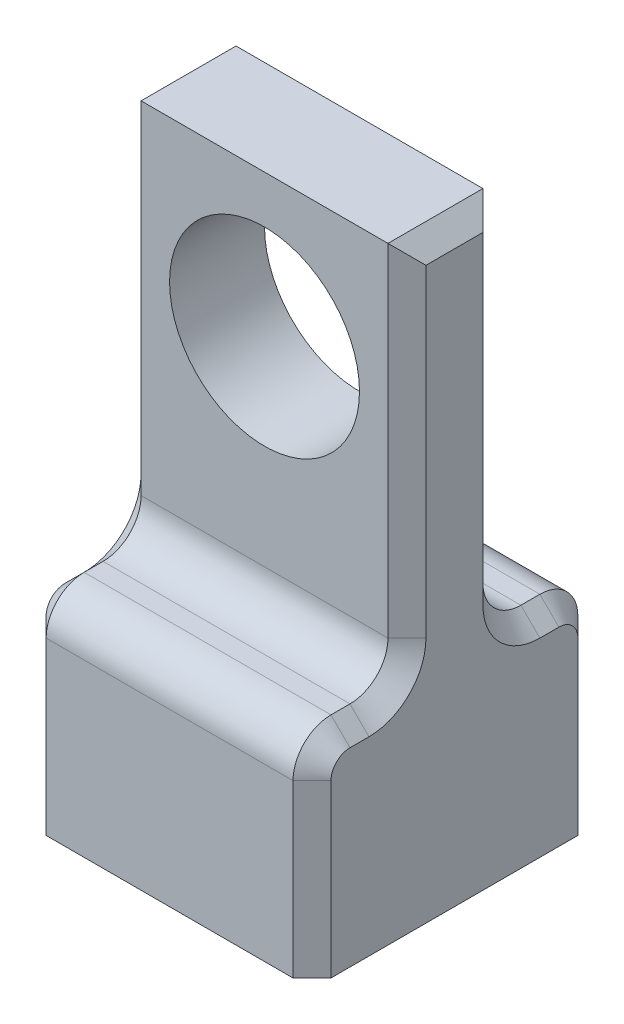
ISO-10303-21;
HEADER;
FILE_DESCRIPTION(('STEP AP214'),'2;1');
FILE_NAME('part.step','',(''),(''),'','','');
FILE_SCHEMA(('AUTOMOTIVE_DESIGN { 1 0 10303 214 1 1 1 1 }'));
ENDSEC;
DATA;
#1=APPLICATION_CONTEXT('core data for automotive mechanical design processes');
#2=APPLICATION_PROTOCOL_DEFINITION('international standard','automotive_design',2000,#1);
#3=PRODUCT_CONTEXT('',#1,'mechanical');
#4=PRODUCT('Part','Part','',(#3));
#5=PRODUCT_RELATED_PRODUCT_CATEGORY('part','',(#4));
#6=PRODUCT_DEFINITION_FORMATION('','',#4);
#7=PRODUCT_DEFINITION_CONTEXT('part definition',#1,'design');
#8=PRODUCT_DEFINITION('design','',#6,#7);
#9=PRODUCT_DEFINITION_SHAPE('','',#8);
#10=(LENGTH_UNIT() NAMED_UNIT(*) SI_UNIT(.MILLI.,.METRE.));
#11=(NAMED_UNIT(*) PLANE_ANGLE_UNIT() SI_UNIT($,.RADIAN.));
#12=(NAMED_UNIT(*) SI_UNIT($,.STERADIAN.) SOLID_ANGLE_UNIT());
#13=UNCERTAINTY_MEASURE_WITH_UNIT(LENGTH_MEASURE(1.E-05),#10,'distance_accuracy_value','');
#14=(GEOMETRIC_REPRESENTATION_CONTEXT(3) GLOBAL_UNCERTAINTY_ASSIGNED_CONTEXT((#13)) GLOBAL_UNIT_ASSIGNED_CONTEXT((#10,
#11,#12)) REPRESENTATION_CONTEXT('',''));
#15=CARTESIAN_POINT('',(0.,0.,0.));
#16=DIRECTION('',(0.,0.,1.));
#17=DIRECTION('',(1.,0.,0.));
#18=AXIS2_PLACEMENT_3D('',#15,#16,#17);
#19=CARTESIAN_POINT('',(-7.5,31.,-7.5));
#20=DIRECTION('',(1.,0.,0.));
#21=DIRECTION('',(0.,0.,-1.));
#22=AXIS2_PLACEMENT_3D('',#19,#20,#21);
#23=PLANE('',#22);
#24=DIRECTION('',(0.,0.,1.));
#25=VECTOR('',#24,1.);
#26=CARTESIAN_POINT('',(-7.5,0.,-7.5));
#27=LINE('',#26,#25);
#28=CARTESIAN_POINT('',(-7.5,0.,-6.49999999999999));
#29=VERTEX_POINT('',#28);
#30=CARTESIAN_POINT('',(-7.5,0.,6.50000000000001));
#31=VERTEX_POINT('',#30);
#32=EDGE_CURVE('E402',#29,#31,#27,.T.);
#33=ORIENTED_EDGE('',*,*,#32,.T.);
#34=DIRECTION('',(0.,1.,0.));
#35=VECTOR('',#34,1.);
#36=CARTESIAN_POINT('',(-7.5,31.,6.50000000000001));
#37=LINE('',#36,#35);
#38=CARTESIAN_POINT('',(-7.5,9.,6.50000000000001));
#39=VERTEX_POINT('',#38);
#40=EDGE_CURVE('E295',#31,#39,#37,.T.);
#41=ORIENTED_EDGE('',*,*,#40,.T.);
#42=CARTESIAN_POINT('',(-7.5,9.,5.5));
#43=DIRECTION('',(1.,0.,0.));
#44=DIRECTION('',(0.,0.,-1.));
#45=AXIS2_PLACEMENT_3D('',#42,#43,#44);
#46=CIRCLE('',#45,1.00000000000001);
#47=CARTESIAN_POINT('',(-7.5,10.,5.5));
#48=VERTEX_POINT('',#47);
#49=EDGE_CURVE('E292',#39,#48,#46,.F.);
#50=ORIENTED_EDGE('',*,*,#49,.T.);
#51=DIRECTION('',(0.,0.,-1.));
#52=VECTOR('',#51,1.);
#53=CARTESIAN_POINT('',(-7.5,10.,4.5));
#54=LINE('',#53,#52);
#55=CARTESIAN_POINT('',(-7.5,10.,4.5));
#56=VERTEX_POINT('',#55);
#57=EDGE_CURVE('E287',#48,#56,#54,.T.);
#58=ORIENTED_EDGE('',*,*,#57,.T.);
#59=CARTESIAN_POINT('',(-7.5,13.,4.5));
#60=DIRECTION('',(1.,0.,0.));
#61=DIRECTION('',(0.,0.,-1.));
#62=AXIS2_PLACEMENT_3D('',#59,#60,#61);
#63=CIRCLE('',#62,2.99999999999999);
#64=CARTESIAN_POINT('',(-7.5,13.,1.50000000000001));
#65=VERTEX_POINT('',#64);
#66=EDGE_CURVE('E286',#56,#65,#63,.T.);
#67=ORIENTED_EDGE('',*,*,#66,.T.);
#68=DIRECTION('',(0.,1.,0.));
#69=VECTOR('',#68,1.);
#70=CARTESIAN_POINT('',(-7.5,31.,1.50000000000001));
#71=LINE('',#70,#69);
#72=CARTESIAN_POINT('',(-7.5,30.,1.50000000000001));
#73=VERTEX_POINT('',#72);
#74=EDGE_CURVE('E288',#65,#73,#71,.T.);
#75=ORIENTED_EDGE('',*,*,#74,.T.);
#76=DIRECTION('',(0.,0.,-1.));
#77=VECTOR('',#76,1.);
#78=CARTESIAN_POINT('',(-7.5,30.,-7.5));
#79=LINE('',#78,#77);
#80=CARTESIAN_POINT('',(-7.5,30.,-1.49999999999999));
#81=VERTEX_POINT('',#80);
#82=EDGE_CURVE('E284',#73,#81,#79,.T.);
#83=ORIENTED_EDGE('',*,*,#82,.T.);
#84=DIRECTION('',(0.,-1.,0.));
#85=VECTOR('',#84,1.);
#86=CARTESIAN_POINT('',(-7.5,31.,-1.49999999999999));
#87=LINE('',#86,#85);
#88=CARTESIAN_POINT('',(-7.5,13.,-1.49999999999999));
#89=VERTEX_POINT('',#88);
#90=EDGE_CURVE('E240',#81,#89,#87,.T.);
#91=ORIENTED_EDGE('',*,*,#90,.T.);
#92=CARTESIAN_POINT('',(-7.5,13.,-4.5));
#93=DIRECTION('',(1.,0.,0.));
#94=DIRECTION('',(0.,0.,-1.));
#95=AXIS2_PLACEMENT_3D('',#92,#93,#94);
#96=CIRCLE('',#95,3.00000000000001);
#97=CARTESIAN_POINT('',(-7.5,9.99999999999999,-4.5));
#98=VERTEX_POINT('',#97);
#99=EDGE_CURVE('E282',#89,#98,#96,.T.);
#100=ORIENTED_EDGE('',*,*,#99,.T.);
#101=DIRECTION('',(0.,0.,-1.));
#102=VECTOR('',#101,1.);
#103=CARTESIAN_POINT('',(-7.5,9.99999999999999,-5.5));
#104=LINE('',#103,#102);
#105=CARTESIAN_POINT('',(-7.5,9.99999999999999,-5.5));
#106=VERTEX_POINT('',#105);
#107=EDGE_CURVE('E276',#98,#106,#104,.T.);
#108=ORIENTED_EDGE('',*,*,#107,.T.);
#109=CARTESIAN_POINT('',(-7.5,9.,-5.5));
#110=DIRECTION('',(1.,0.,0.));
#111=DIRECTION('',(0.,0.,-1.));
#112=AXIS2_PLACEMENT_3D('',#109,#110,#111);
#113=CIRCLE('',#112,0.999999999999987);
#114=CARTESIAN_POINT('',(-7.5,9.,-6.49999999999999));
#115=VERTEX_POINT('',#114);
#116=EDGE_CURVE('E273',#106,#115,#113,.F.);
#117=ORIENTED_EDGE('',*,*,#116,.T.);
#118=DIRECTION('',(0.,-1.,0.));
#119=VECTOR('',#118,1.);
#120=CARTESIAN_POINT('',(-7.5,31.,-6.49999999999999));
#121=LINE('',#120,#119);
#122=EDGE_CURVE('E280',#115,#29,#121,.T.);
#123=ORIENTED_EDGE('',*,*,#122,.T.);
#124=EDGE_LOOP('',(#33,#41,#50,#58,#67,#75,#83,#91,#100,#108,#117,#123));
#125=FACE_BOUND('',#124,.T.);
#126=ADVANCED_FACE('F41',(#125),#23,.F.);
#127=CARTESIAN_POINT('',(7.5,31.,7.5));
#128=DIRECTION('',(0.,0.,-1.));
#129=DIRECTION('',(-1.,0.,0.));
#130=AXIS2_PLACEMENT_3D('',#127,#128,#129);
#131=PLANE('',#130);
#132=DIRECTION('',(1.,0.,0.));
#133=VECTOR('',#132,1.);
#134=CARTESIAN_POINT('',(-7.5,9.,7.5));
#135=LINE('',#134,#133);
#136=CARTESIAN_POINT('',(6.49999999999999,9.,7.5));
#137=VERTEX_POINT('',#136);
#138=CARTESIAN_POINT('',(-6.5,9.,7.5));
#139=VERTEX_POINT('',#138);
#140=EDGE_CURVE('E427',#137,#139,#135,.F.);
#141=ORIENTED_EDGE('',*,*,#140,.T.);
#142=DIRECTION('',(0.,-1.,0.));
#143=VECTOR('',#142,1.);
#144=CARTESIAN_POINT('',(-6.5,31.,7.5));
#145=LINE('',#144,#143);
#146=CARTESIAN_POINT('',(-6.5,0.,7.5));
#147=VERTEX_POINT('',#146);
#148=EDGE_CURVE('E296',#139,#147,#145,.T.);
#149=ORIENTED_EDGE('',*,*,#148,.T.);
#150=DIRECTION('',(1.,0.,0.));
#151=VECTOR('',#150,1.);
#152=CARTESIAN_POINT('',(7.5,0.,7.5));
#153=LINE('',#152,#151);
#154=CARTESIAN_POINT('',(6.49999999999999,0.,7.5));
#155=VERTEX_POINT('',#154);
#156=EDGE_CURVE('E409',#147,#155,#153,.T.);
#157=ORIENTED_EDGE('',*,*,#156,.T.);
#158=DIRECTION('',(0.,1.,0.));
#159=VECTOR('',#158,1.);
#160=CARTESIAN_POINT('',(6.49999999999999,31.,7.5));
#161=LINE('',#160,#159);
#162=EDGE_CURVE('E298',#155,#137,#161,.T.);
#163=ORIENTED_EDGE('',*,*,#162,.T.);
#164=EDGE_LOOP('',(#141,#149,#157,#163));
#165=FACE_BOUND('',#164,.T.);
#166=ADVANCED_FACE('F462',(#165),#131,.F.);
#167=CARTESIAN_POINT('',(7.5,31.,-7.5));
#168=DIRECTION('',(-1.,0.,0.));
#169=DIRECTION('',(0.,0.,1.));
#170=AXIS2_PLACEMENT_3D('',#167,#168,#169);
#171=PLANE('',#170);
#172=DIRECTION('',(0.,0.,-1.));
#173=VECTOR('',#172,1.);
#174=CARTESIAN_POINT('',(7.5,0.,-7.5));
#175=LINE('',#174,#173);
#176=CARTESIAN_POINT('',(7.5,0.,6.49999999999999));
#177=VERTEX_POINT('',#176);
#178=CARTESIAN_POINT('',(7.5,0.,-6.5));
#179=VERTEX_POINT('',#178);
#180=EDGE_CURVE('E415',#177,#179,#175,.T.);
#181=ORIENTED_EDGE('',*,*,#180,.T.);
#182=DIRECTION('',(0.,1.,0.));
#183=VECTOR('',#182,1.);
#184=CARTESIAN_POINT('',(7.5,31.,-6.5));
#185=LINE('',#184,#183);
#186=CARTESIAN_POINT('',(7.5,9.,-6.5));
#187=VERTEX_POINT('',#186);
#188=EDGE_CURVE('E271',#179,#187,#185,.T.);
#189=ORIENTED_EDGE('',*,*,#188,.T.);
#190=CARTESIAN_POINT('',(7.5,9.,-5.5));
#191=DIRECTION('',(-1.,0.,0.));
#192=DIRECTION('',(0.,0.,1.));
#193=AXIS2_PLACEMENT_3D('',#190,#191,#192);
#194=CIRCLE('',#193,0.999999999999996);
#195=CARTESIAN_POINT('',(7.5,9.99999999999999,-5.5));
#196=VERTEX_POINT('',#195);
#197=EDGE_CURVE('E272',#187,#196,#194,.F.);
#198=ORIENTED_EDGE('',*,*,#197,.T.);
#199=DIRECTION('',(0.,0.,1.));
#200=VECTOR('',#199,1.);
#201=CARTESIAN_POINT('',(7.5,9.99999999999999,-4.5));
#202=LINE('',#201,#200);
#203=CARTESIAN_POINT('',(7.5,10.,-4.5));
#204=VERTEX_POINT('',#203);
#205=EDGE_CURVE('E269',#196,#204,#202,.T.);
#206=ORIENTED_EDGE('',*,*,#205,.T.);
#207=CARTESIAN_POINT('',(7.5,13.,-4.5));
#208=DIRECTION('',(-1.,0.,0.));
#209=DIRECTION('',(0.,0.,1.));
#210=AXIS2_PLACEMENT_3D('',#207,#208,#209);
#211=CIRCLE('',#210,3.);
#212=CARTESIAN_POINT('',(7.5,13.,-1.5));
#213=VERTEX_POINT('',#212);
#214=EDGE_CURVE('E270',#204,#213,#211,.T.);
#215=ORIENTED_EDGE('',*,*,#214,.T.);
#216=DIRECTION('',(0.,1.,0.));
#217=VECTOR('',#216,1.);
#218=CARTESIAN_POINT('',(7.5,31.,-1.5));
#219=LINE('',#218,#217);
#220=CARTESIAN_POINT('',(7.5,30.,-1.5));
#221=VERTEX_POINT('',#220);
#222=EDGE_CURVE('E261',#213,#221,#219,.T.);
#223=ORIENTED_EDGE('',*,*,#222,.T.);
#224=DIRECTION('',(0.,0.,1.));
#225=VECTOR('',#224,1.);
#226=CARTESIAN_POINT('',(7.5,30.,-7.5));
#227=LINE('',#226,#225);
#228=CARTESIAN_POINT('',(7.5,30.,1.5));
#229=VERTEX_POINT('',#228);
#230=EDGE_CURVE('E263',#221,#229,#227,.T.);
#231=ORIENTED_EDGE('',*,*,#230,.T.);
#232=DIRECTION('',(0.,-1.,0.));
#233=VECTOR('',#232,1.);
#234=CARTESIAN_POINT('',(7.5,31.,1.5));
#235=LINE('',#234,#233);
#236=CARTESIAN_POINT('',(7.5,13.,1.5));
#237=VERTEX_POINT('',#236);
#238=EDGE_CURVE('E262',#229,#237,#235,.T.);
#239=ORIENTED_EDGE('',*,*,#238,.T.);
#240=CARTESIAN_POINT('',(7.5,13.,4.5));
#241=DIRECTION('',(-1.,0.,0.));
#242=DIRECTION('',(0.,0.,1.));
#243=AXIS2_PLACEMENT_3D('',#240,#241,#242);
#244=CIRCLE('',#243,3.);
#245=CARTESIAN_POINT('',(7.5,9.99999999999999,4.5));
#246=VERTEX_POINT('',#245);
#247=EDGE_CURVE('E256',#237,#246,#244,.T.);
#248=ORIENTED_EDGE('',*,*,#247,.T.);
#249=DIRECTION('',(0.,0.,1.));
#250=VECTOR('',#249,1.);
#251=CARTESIAN_POINT('',(7.5,9.99999999999999,5.5));
#252=LINE('',#251,#250);
#253=CARTESIAN_POINT('',(7.5,9.99999999999999,5.5));
#254=VERTEX_POINT('',#253);
#255=EDGE_CURVE('E260',#246,#254,#252,.T.);
#256=ORIENTED_EDGE('',*,*,#255,.T.);
#257=CARTESIAN_POINT('',(7.5,9.,5.5));
#258=DIRECTION('',(-1.,0.,0.));
#259=DIRECTION('',(0.,0.,1.));
#260=AXIS2_PLACEMENT_3D('',#257,#258,#259);
#261=CIRCLE('',#260,0.999999999999997);
#262=CARTESIAN_POINT('',(7.5,9.,6.49999999999999));
#263=VERTEX_POINT('',#262);
#264=EDGE_CURVE('E247',#254,#263,#261,.F.);
#265=ORIENTED_EDGE('',*,*,#264,.T.);
#266=DIRECTION('',(0.,-1.,0.));
#267=VECTOR('',#266,1.);
#268=CARTESIAN_POINT('',(7.5,31.,6.49999999999999));
#269=LINE('',#268,#267);
#270=EDGE_CURVE('E253',#263,#177,#269,.T.);
#271=ORIENTED_EDGE('',*,*,#270,.T.);
#272=EDGE_LOOP('',(#181,#189,#198,#206,#215,#223,#231,#239,#248,#256,#265,#271));
#273=FACE_BOUND('',#272,.T.);
#274=ADVANCED_FACE('F454',(#273),#171,.F.);
#275=CARTESIAN_POINT('',(7.5,31.,-7.5));
#276=DIRECTION('',(0.,0.,1.));
#277=DIRECTION('',(1.,0.,0.));
#278=AXIS2_PLACEMENT_3D('',#275,#276,#277);
#279=PLANE('',#278);
#280=DIRECTION('',(-1.,0.,0.));
#281=VECTOR('',#280,1.);
#282=CARTESIAN_POINT('',(7.5,0.,-7.5));
#283=LINE('',#282,#281);
#284=CARTESIAN_POINT('',(6.49999999999999,0.,-7.5));
#285=VERTEX_POINT('',#284);
#286=CARTESIAN_POINT('',(-6.49999999999998,0.,-7.5));
#287=VERTEX_POINT('',#286);
#288=EDGE_CURVE('E417',#285,#287,#283,.T.);
#289=ORIENTED_EDGE('',*,*,#288,.T.);
#290=DIRECTION('',(0.,1.,0.));
#291=VECTOR('',#290,1.);
#292=CARTESIAN_POINT('',(-6.49999999999998,31.,-7.5));
#293=LINE('',#292,#291);
#294=CARTESIAN_POINT('',(-6.49999999999998,9.,-7.5));
#295=VERTEX_POINT('',#294);
#296=EDGE_CURVE('E63',#287,#295,#293,.T.);
#297=ORIENTED_EDGE('',*,*,#296,.T.);
#298=DIRECTION('',(-1.,0.,0.));
#299=VECTOR('',#298,1.);
#300=CARTESIAN_POINT('',(7.5,9.,-7.5));
#301=LINE('',#300,#299);
#302=CARTESIAN_POINT('',(6.49999999999999,9.,-7.5));
#303=VERTEX_POINT('',#302);
#304=EDGE_CURVE('E437',#295,#303,#301,.F.);
#305=ORIENTED_EDGE('',*,*,#304,.T.);
#306=DIRECTION('',(0.,-1.,0.));
#307=VECTOR('',#306,1.);
#308=CARTESIAN_POINT('',(6.49999999999999,31.,-7.5));
#309=LINE('',#308,#307);
#310=EDGE_CURVE('E335',#303,#285,#309,.T.);
#311=ORIENTED_EDGE('',*,*,#310,.T.);
#312=EDGE_LOOP('',(#289,#297,#305,#311));
#313=FACE_BOUND('',#312,.T.);
#314=ADVANCED_FACE('F441',(#313),#279,.F.);
#315=CARTESIAN_POINT('',(0.,31.,0.));
#316=DIRECTION('',(0.,-1.,0.));
#317=DIRECTION('',(0.,0.,-1.));
#318=AXIS2_PLACEMENT_3D('',#315,#316,#317);
#319=PLANE('',#318);
#320=DIRECTION('',(-1.,0.,0.));
#321=VECTOR('',#320,1.);
#322=CARTESIAN_POINT('',(7.5,31.,2.5));
#323=LINE('',#322,#321);
#324=CARTESIAN_POINT('',(6.49999999999999,31.,2.5));
#325=VERTEX_POINT('',#324);
#326=CARTESIAN_POINT('',(-6.49999999999999,31.,2.5));
#327=VERTEX_POINT('',#326);
#328=EDGE_CURVE('E233',#325,#327,#323,.T.);
#329=ORIENTED_EDGE('',*,*,#328,.F.);
#330=DIRECTION('',(0.,0.,-1.));
#331=VECTOR('',#330,1.);
#332=CARTESIAN_POINT('',(6.50000000000001,31.,0.));
#333=LINE('',#332,#331);
#334=CARTESIAN_POINT('',(6.49999999999999,31.,-2.5));
#335=VERTEX_POINT('',#334);
#336=EDGE_CURVE('E230',#325,#335,#333,.T.);
#337=ORIENTED_EDGE('',*,*,#336,.T.);
#338=DIRECTION('',(1.,0.,0.));
#339=VECTOR('',#338,1.);
#340=CARTESIAN_POINT('',(-7.5,31.,-2.5));
#341=LINE('',#340,#339);
#342=CARTESIAN_POINT('',(-6.49999999999998,31.,-2.5));
#343=VERTEX_POINT('',#342);
#344=EDGE_CURVE('E208',#343,#335,#341,.T.);
#345=ORIENTED_EDGE('',*,*,#344,.F.);
#346=DIRECTION('',(0.,0.,1.));
#347=VECTOR('',#346,1.);
#348=CARTESIAN_POINT('',(-6.5,31.,0.));
#349=LINE('',#348,#347);
#350=EDGE_CURVE('E228',#343,#327,#349,.T.);
#351=ORIENTED_EDGE('',*,*,#350,.T.);
#352=EDGE_LOOP('',(#329,#337,#345,#351));
#353=FACE_BOUND('',#352,.T.);
#354=ADVANCED_FACE('F224',(#353),#319,.F.);
#355=CARTESIAN_POINT('',(0.,0.,0.));
#356=DIRECTION('',(0.,-1.,0.));
#357=DIRECTION('',(0.,0.,-1.));
#358=AXIS2_PLACEMENT_3D('',#355,#356,#357);
#359=PLANE('',#358);
#360=CARTESIAN_POINT('',(0.,0.,4.));
#361=DIRECTION('',(0.,-1.,0.));
#362=DIRECTION('',(0.,0.,-1.));
#363=AXIS2_PLACEMENT_3D('',#360,#361,#362);
#364=CIRCLE('',#363,1.5);
#365=CARTESIAN_POINT('',(0.,0.,2.5));
#366=VERTEX_POINT('',#365);
#367=EDGE_CURVE('E953',#366,#366,#364,.T.);
#368=ORIENTED_EDGE('',*,*,#367,.F.);
#369=EDGE_LOOP('',(#368));
#370=FACE_BOUND('',#369,.T.);
#371=CARTESIAN_POINT('',(0.,0.,-4.));
#372=DIRECTION('',(0.,-1.,0.));
#373=DIRECTION('',(0.,0.,-1.));
#374=AXIS2_PLACEMENT_3D('',#371,#372,#373);
#375=CIRCLE('',#374,1.5);
#376=CARTESIAN_POINT('',(0.,0.,-5.5));
#377=VERTEX_POINT('',#376);
#378=EDGE_CURVE('E956',#377,#377,#375,.T.);
#379=ORIENTED_EDGE('',*,*,#378,.F.);
#380=EDGE_LOOP('',(#379));
#381=FACE_BOUND('',#380,.T.);
#382=ORIENTED_EDGE('',*,*,#156,.F.);
#383=DIRECTION('',(0.70710678118655,0.,0.707106781186545));
#384=VECTOR('',#383,1.);
#385=CARTESIAN_POINT('',(-6.99999999999998,0.,7.00000000000002));
#386=LINE('',#385,#384);
#387=EDGE_CURVE('E306',#147,#31,#386,.F.);
#388=ORIENTED_EDGE('',*,*,#387,.T.);
#389=ORIENTED_EDGE('',*,*,#32,.F.);
#390=DIRECTION('',(-0.707106781186549,0.,0.707106781186546));
#391=VECTOR('',#390,1.);
#392=CARTESIAN_POINT('',(-6.99999999999997,0.,-7.00000000000001));
#393=LINE('',#392,#391);
#394=EDGE_CURVE('E302',#29,#287,#393,.F.);
#395=ORIENTED_EDGE('',*,*,#394,.T.);
#396=ORIENTED_EDGE('',*,*,#288,.F.);
#397=DIRECTION('',(-0.70710678118655,0.,-0.707106781186545));
#398=VECTOR('',#397,1.);
#399=CARTESIAN_POINT('',(6.99999999999997,0.,-7.00000000000002));
#400=LINE('',#399,#398);
#401=EDGE_CURVE('E305',#285,#179,#400,.F.);
#402=ORIENTED_EDGE('',*,*,#401,.T.);
#403=ORIENTED_EDGE('',*,*,#180,.F.);
#404=DIRECTION('',(0.70710678118655,0.,-0.707106781186545));
#405=VECTOR('',#404,1.);
#406=CARTESIAN_POINT('',(6.99999999999997,0.,7.00000000000002));
#407=LINE('',#406,#405);
#408=EDGE_CURVE('E297',#177,#155,#407,.F.);
#409=ORIENTED_EDGE('',*,*,#408,.T.);
#410=EDGE_LOOP('',(#382,#388,#389,#395,#396,#402,#403,#409));
#411=FACE_BOUND('',#410,.T.);
#412=ADVANCED_FACE('F403',(#370,#381,#411),#359,.T.);
#413=CARTESIAN_POINT('',(7.5,11.,2.5));
#414=DIRECTION('',(0.,0.,-1.));
#415=DIRECTION('',(-1.,0.,0.));
#416=AXIS2_PLACEMENT_3D('',#413,#414,#415);
#417=PLANE('',#416);
#418=ORIENTED_EDGE('',*,*,#328,.T.);
#419=DIRECTION('',(0.,-1.,0.));
#420=VECTOR('',#419,1.);
#421=CARTESIAN_POINT('',(-6.5,11.,2.5));
#422=LINE('',#421,#420);
#423=CARTESIAN_POINT('',(-6.5,13.,2.5));
#424=VERTEX_POINT('',#423);
#425=EDGE_CURVE('E319',#327,#424,#422,.T.);
#426=ORIENTED_EDGE('',*,*,#425,.T.);
#427=DIRECTION('',(-1.,0.,0.));
#428=VECTOR('',#427,1.);
#429=CARTESIAN_POINT('',(7.5,13.,2.5));
#430=LINE('',#429,#428);
#431=CARTESIAN_POINT('',(6.49999999999999,13.,2.5));
#432=VERTEX_POINT('',#431);
#433=EDGE_CURVE('E246',#424,#432,#430,.F.);
#434=ORIENTED_EDGE('',*,*,#433,.T.);
#435=DIRECTION('',(0.,1.,0.));
#436=VECTOR('',#435,1.);
#437=CARTESIAN_POINT('',(6.49999999999999,11.,2.5));
#438=LINE('',#437,#436);
#439=EDGE_CURVE('E317',#432,#325,#438,.T.);
#440=ORIENTED_EDGE('',*,*,#439,.T.);
#441=EDGE_LOOP('',(#418,#426,#434,#440));
#442=FACE_BOUND('',#441,.T.);
#443=CARTESIAN_POINT('',(0.,23.5,2.5));
#444=DIRECTION('',(0.,0.,-1.));
#445=DIRECTION('',(-1.,0.,0.));
#446=AXIS2_PLACEMENT_3D('',#443,#444,#445);
#447=CIRCLE('',#446,5.);
#448=CARTESIAN_POINT('',(-5.,23.5,2.5));
#449=VERTEX_POINT('',#448);
#450=EDGE_CURVE('E229',#449,#449,#447,.F.);
#451=ORIENTED_EDGE('',*,*,#450,.F.);
#452=EDGE_LOOP('',(#451));
#453=FACE_BOUND('',#452,.T.);
#454=ADVANCED_FACE('F685',(#442,#453),#417,.F.);
#455=CARTESIAN_POINT('',(0.,11.,0.));
#456=DIRECTION('',(0.,1.,0.));
#457=DIRECTION('',(0.,0.,1.));
#458=AXIS2_PLACEMENT_3D('',#455,#456,#457);
#459=PLANE('',#458);
#460=DIRECTION('',(-1.,0.,0.));
#461=VECTOR('',#460,1.);
#462=CARTESIAN_POINT('',(0.,11.,4.5));
#463=LINE('',#462,#461);
#464=CARTESIAN_POINT('',(6.49999999999999,11.,4.5));
#465=VERTEX_POINT('',#464);
#466=CARTESIAN_POINT('',(-6.5,11.,4.5));
#467=VERTEX_POINT('',#466);
#468=EDGE_CURVE('E422',#465,#467,#463,.T.);
#469=ORIENTED_EDGE('',*,*,#468,.T.);
#470=DIRECTION('',(0.,0.,1.));
#471=VECTOR('',#470,1.);
#472=CARTESIAN_POINT('',(-6.5,11.,5.5));
#473=LINE('',#472,#471);
#474=CARTESIAN_POINT('',(-6.5,11.,5.5));
#475=VERTEX_POINT('',#474);
#476=EDGE_CURVE('E313',#467,#475,#473,.T.);
#477=ORIENTED_EDGE('',*,*,#476,.T.);
#478=DIRECTION('',(1.,0.,0.));
#479=VECTOR('',#478,1.);
#480=CARTESIAN_POINT('',(7.5,11.,5.5));
#481=LINE('',#480,#479);
#482=CARTESIAN_POINT('',(6.49999999999999,11.,5.5));
#483=VERTEX_POINT('',#482);
#484=EDGE_CURVE('E430',#475,#483,#481,.T.);
#485=ORIENTED_EDGE('',*,*,#484,.T.);
#486=DIRECTION('',(0.,0.,-1.));
#487=VECTOR('',#486,1.);
#488=CARTESIAN_POINT('',(6.49999999999999,11.,4.5));
#489=LINE('',#488,#487);
#490=EDGE_CURVE('E315',#483,#465,#489,.T.);
#491=ORIENTED_EDGE('',*,*,#490,.T.);
#492=EDGE_LOOP('',(#469,#477,#485,#491));
#493=FACE_BOUND('',#492,.T.);
#494=ADVANCED_FACE('F839',(#493),#459,.T.);
#495=CARTESIAN_POINT('',(-7.5,11.,-2.5));
#496=DIRECTION('',(0.,0.,1.));
#497=DIRECTION('',(1.,0.,0.));
#498=AXIS2_PLACEMENT_3D('',#495,#496,#497);
#499=PLANE('',#498);
#500=DIRECTION('',(1.,0.,0.));
#501=VECTOR('',#500,1.);
#502=CARTESIAN_POINT('',(-7.5,13.,-2.5));
#503=LINE('',#502,#501);
#504=CARTESIAN_POINT('',(6.49999999999999,13.,-2.5));
#505=VERTEX_POINT('',#504);
#506=CARTESIAN_POINT('',(-6.49999999999998,13.,-2.5));
#507=VERTEX_POINT('',#506);
#508=EDGE_CURVE('E215',#505,#507,#503,.F.);
#509=ORIENTED_EDGE('',*,*,#508,.T.);
#510=DIRECTION('',(0.,1.,0.));
#511=VECTOR('',#510,1.);
#512=CARTESIAN_POINT('',(-6.49999999999998,11.,-2.5));
#513=LINE('',#512,#511);
#514=EDGE_CURVE('E207',#507,#343,#513,.T.);
#515=ORIENTED_EDGE('',*,*,#514,.T.);
#516=ORIENTED_EDGE('',*,*,#344,.T.);
#517=DIRECTION('',(0.,-1.,0.));
#518=VECTOR('',#517,1.);
#519=CARTESIAN_POINT('',(6.49999999999999,11.,-2.5));
#520=LINE('',#519,#518);
#521=EDGE_CURVE('E218',#335,#505,#520,.T.);
#522=ORIENTED_EDGE('',*,*,#521,.T.);
#523=EDGE_LOOP('',(#509,#515,#516,#522));
#524=FACE_BOUND('',#523,.T.);
#525=CARTESIAN_POINT('',(0.,23.5,-2.5));
#526=DIRECTION('',(0.,0.,1.));
#527=DIRECTION('',(1.,0.,0.));
#528=AXIS2_PLACEMENT_3D('',#525,#526,#527);
#529=CIRCLE('',#528,5.);
#530=CARTESIAN_POINT('',(5.,23.5,-2.5));
#531=VERTEX_POINT('',#530);
#532=EDGE_CURVE('E406',#531,#531,#529,.F.);
#533=ORIENTED_EDGE('',*,*,#532,.F.);
#534=EDGE_LOOP('',(#533));
#535=FACE_BOUND('',#534,.T.);
#536=ADVANCED_FACE('F206',(#524,#535),#499,.F.);
#537=CARTESIAN_POINT('',(0.,11.,0.));
#538=DIRECTION('',(0.,1.,0.));
#539=DIRECTION('',(0.,0.,1.));
#540=AXIS2_PLACEMENT_3D('',#537,#538,#539);
#541=PLANE('',#540);
#542=DIRECTION('',(-1.,0.,0.));
#543=VECTOR('',#542,1.);
#544=CARTESIAN_POINT('',(-7.5,11.,-5.5));
#545=LINE('',#544,#543);
#546=CARTESIAN_POINT('',(6.49999999999999,11.,-5.5));
#547=VERTEX_POINT('',#546);
#548=CARTESIAN_POINT('',(-6.49999999999998,11.,-5.5));
#549=VERTEX_POINT('',#548);
#550=EDGE_CURVE('E436',#547,#549,#545,.T.);
#551=ORIENTED_EDGE('',*,*,#550,.T.);
#552=DIRECTION('',(0.,0.,1.));
#553=VECTOR('',#552,1.);
#554=CARTESIAN_POINT('',(-6.49999999999998,11.,-4.5));
#555=LINE('',#554,#553);
#556=CARTESIAN_POINT('',(-6.49999999999998,11.,-4.5));
#557=VERTEX_POINT('',#556);
#558=EDGE_CURVE('E326',#549,#557,#555,.T.);
#559=ORIENTED_EDGE('',*,*,#558,.T.);
#560=DIRECTION('',(1.,0.,0.));
#561=VECTOR('',#560,1.);
#562=CARTESIAN_POINT('',(0.,11.,-4.5));
#563=LINE('',#562,#561);
#564=CARTESIAN_POINT('',(6.49999999999999,11.,-4.5));
#565=VERTEX_POINT('',#564);
#566=EDGE_CURVE('E433',#557,#565,#563,.T.);
#567=ORIENTED_EDGE('',*,*,#566,.T.);
#568=DIRECTION('',(0.,0.,-1.));
#569=VECTOR('',#568,1.);
#570=CARTESIAN_POINT('',(6.49999999999999,11.,-5.5));
#571=LINE('',#570,#569);
#572=EDGE_CURVE('E328',#565,#547,#571,.T.);
#573=ORIENTED_EDGE('',*,*,#572,.T.);
#574=EDGE_LOOP('',(#551,#559,#567,#573));
#575=FACE_BOUND('',#574,.T.);
#576=ADVANCED_FACE('F826',(#575),#541,.T.);
#577=CARTESIAN_POINT('',(0.,23.5,-17.5));
#578=DIRECTION('',(0.,0.,1.));
#579=DIRECTION('',(1.,0.,0.));
#580=AXIS2_PLACEMENT_3D('',#577,#578,#579);
#581=CYLINDRICAL_SURFACE('',#580,5.);
#582=ORIENTED_EDGE('',*,*,#532,.T.);
#583=EDGE_LOOP('',(#582));
#584=FACE_BOUND('',#583,.T.);
#585=ORIENTED_EDGE('',*,*,#450,.T.);
#586=EDGE_LOOP('',(#585));
#587=FACE_BOUND('',#586,.T.);
#588=ADVANCED_FACE('F501',(#584,#587),#581,.F.);
#589=CARTESIAN_POINT('',(0.,9.,5.5));
#590=DIRECTION('',(-1.,0.,0.));
#591=DIRECTION('',(0.,0.,1.));
#592=AXIS2_PLACEMENT_3D('',#589,#590,#591);
#593=CYLINDRICAL_SURFACE('',#592,2.);
#594=ORIENTED_EDGE('',*,*,#484,.F.);
#595=CARTESIAN_POINT('',(-6.5,9.,5.5));
#596=DIRECTION('',(1.,0.,0.));
#597=DIRECTION('',(0.,0.,-1.));
#598=AXIS2_PLACEMENT_3D('',#595,#596,#597);
#599=CIRCLE('',#598,2.);
#600=EDGE_CURVE('E309',#475,#139,#599,.T.);
#601=ORIENTED_EDGE('',*,*,#600,.T.);
#602=ORIENTED_EDGE('',*,*,#140,.F.);
#603=CARTESIAN_POINT('',(6.49999999999999,9.,5.5));
#604=DIRECTION('',(-1.,0.,0.));
#605=DIRECTION('',(0.,0.,1.));
#606=AXIS2_PLACEMENT_3D('',#603,#604,#605);
#607=CIRCLE('',#606,2.);
#608=EDGE_CURVE('E308',#137,#483,#607,.T.);
#609=ORIENTED_EDGE('',*,*,#608,.T.);
#610=EDGE_LOOP('',(#594,#601,#602,#609));
#611=FACE_BOUND('',#610,.T.);
#612=ADVANCED_FACE('F469',(#611),#593,.T.);
#613=CARTESIAN_POINT('',(0.,9.,-5.5));
#614=DIRECTION('',(1.,0.,0.));
#615=DIRECTION('',(0.,0.,-1.));
#616=AXIS2_PLACEMENT_3D('',#613,#614,#615);
#617=CYLINDRICAL_SURFACE('',#616,2.);
#618=ORIENTED_EDGE('',*,*,#304,.F.);
#619=CARTESIAN_POINT('',(-6.49999999999998,9.,-5.5));
#620=DIRECTION('',(1.,0.,0.));
#621=DIRECTION('',(0.,0.,-1.));
#622=AXIS2_PLACEMENT_3D('',#619,#620,#621);
#623=CIRCLE('',#622,2.);
#624=EDGE_CURVE('E11',#295,#549,#623,.T.);
#625=ORIENTED_EDGE('',*,*,#624,.T.);
#626=ORIENTED_EDGE('',*,*,#550,.F.);
#627=CARTESIAN_POINT('',(6.49999999999999,9.,-5.5));
#628=DIRECTION('',(-1.,0.,0.));
#629=DIRECTION('',(0.,0.,1.));
#630=AXIS2_PLACEMENT_3D('',#627,#628,#629);
#631=CIRCLE('',#630,2.);
#632=EDGE_CURVE('E51',#547,#303,#631,.T.);
#633=ORIENTED_EDGE('',*,*,#632,.T.);
#634=EDGE_LOOP('',(#618,#625,#626,#633));
#635=FACE_BOUND('',#634,.T.);
#636=ADVANCED_FACE('F499',(#635),#617,.T.);
#637=CARTESIAN_POINT('',(0.,13.,-4.5));
#638=DIRECTION('',(1.,0.,0.));
#639=DIRECTION('',(0.,0.,-1.));
#640=AXIS2_PLACEMENT_3D('',#637,#638,#639);
#641=CYLINDRICAL_SURFACE('',#640,2.);
#642=ORIENTED_EDGE('',*,*,#566,.F.);
#643=CARTESIAN_POINT('',(-6.49999999999998,13.,-4.5));
#644=DIRECTION('',(1.,0.,0.));
#645=DIRECTION('',(0.,0.,-1.));
#646=AXIS2_PLACEMENT_3D('',#643,#644,#645);
#647=CIRCLE('',#646,2.);
#648=EDGE_CURVE('E327',#557,#507,#647,.F.);
#649=ORIENTED_EDGE('',*,*,#648,.T.);
#650=ORIENTED_EDGE('',*,*,#508,.F.);
#651=CARTESIAN_POINT('',(6.49999999999999,13.,-4.5));
#652=DIRECTION('',(-1.,0.,0.));
#653=DIRECTION('',(0.,0.,1.));
#654=AXIS2_PLACEMENT_3D('',#651,#652,#653);
#655=CIRCLE('',#654,2.);
#656=EDGE_CURVE('E220',#505,#565,#655,.F.);
#657=ORIENTED_EDGE('',*,*,#656,.T.);
#658=EDGE_LOOP('',(#642,#649,#650,#657));
#659=FACE_BOUND('',#658,.T.);
#660=ADVANCED_FACE('F502',(#659),#641,.F.);
#661=CARTESIAN_POINT('',(0.,13.,4.5));
#662=DIRECTION('',(-1.,0.,0.));
#663=DIRECTION('',(0.,0.,1.));
#664=AXIS2_PLACEMENT_3D('',#661,#662,#663);
#665=CYLINDRICAL_SURFACE('',#664,2.);
#666=ORIENTED_EDGE('',*,*,#433,.F.);
#667=CARTESIAN_POINT('',(-6.5,13.,4.5));
#668=DIRECTION('',(1.,0.,0.));
#669=DIRECTION('',(0.,0.,-1.));
#670=AXIS2_PLACEMENT_3D('',#667,#668,#669);
#671=CIRCLE('',#670,2.);
#672=EDGE_CURVE('E325',#424,#467,#671,.F.);
#673=ORIENTED_EDGE('',*,*,#672,.T.);
#674=ORIENTED_EDGE('',*,*,#468,.F.);
#675=CARTESIAN_POINT('',(6.49999999999999,13.,4.5));
#676=DIRECTION('',(-1.,0.,0.));
#677=DIRECTION('',(0.,0.,1.));
#678=AXIS2_PLACEMENT_3D('',#675,#676,#677);
#679=CIRCLE('',#678,2.);
#680=EDGE_CURVE('E318',#465,#432,#679,.F.);
#681=ORIENTED_EDGE('',*,*,#680,.T.);
#682=EDGE_LOOP('',(#666,#673,#674,#681));
#683=FACE_BOUND('',#682,.T.);
#684=ADVANCED_FACE('F510',(#683),#665,.F.);
#685=CARTESIAN_POINT('',(7.5,31.,6.49999999999999));
#686=DIRECTION('',(-0.707106781186545,0.,-0.70710678118655));
#687=DIRECTION('',(0.,-1.,0.));
#688=AXIS2_PLACEMENT_3D('',#685,#686,#687);
#689=PLANE('',#688);
#690=ORIENTED_EDGE('',*,*,#408,.F.);
#691=ORIENTED_EDGE('',*,*,#270,.F.);
#692=DIRECTION('',(0.70710678118655,0.,-0.707106781186545));
#693=VECTOR('',#692,1.);
#694=CARTESIAN_POINT('',(6.49999999999999,9.,7.5));
#695=LINE('',#694,#693);
#696=EDGE_CURVE('E365',#137,#263,#695,.T.);
#697=ORIENTED_EDGE('',*,*,#696,.F.);
#698=ORIENTED_EDGE('',*,*,#162,.F.);
#699=EDGE_LOOP('',(#690,#691,#697,#698));
#700=FACE_BOUND('',#699,.T.);
#701=ADVANCED_FACE('F456',(#700),#689,.F.);
#702=CARTESIAN_POINT('',(6.49999999999999,31.,-7.5));
#703=DIRECTION('',(-0.707106781186545,0.,0.70710678118655));
#704=DIRECTION('',(0.,-1.,0.));
#705=AXIS2_PLACEMENT_3D('',#702,#703,#704);
#706=PLANE('',#705);
#707=ORIENTED_EDGE('',*,*,#401,.F.);
#708=ORIENTED_EDGE('',*,*,#310,.F.);
#709=DIRECTION('',(-0.70710678118655,0.,-0.707106781186545));
#710=VECTOR('',#709,1.);
#711=CARTESIAN_POINT('',(7.5,9.,-6.5));
#712=LINE('',#711,#710);
#713=EDGE_CURVE('E360',#187,#303,#712,.T.);
#714=ORIENTED_EDGE('',*,*,#713,.F.);
#715=ORIENTED_EDGE('',*,*,#188,.F.);
#716=EDGE_LOOP('',(#707,#708,#714,#715));
#717=FACE_BOUND('',#716,.T.);
#718=ADVANCED_FACE('F444',(#717),#706,.F.);
#719=CARTESIAN_POINT('',(7.5,9.,5.5));
#720=DIRECTION('',(-1.,0.,0.));
#721=DIRECTION('',(0.,0.,1.));
#722=AXIS2_PLACEMENT_3D('',#719,#720,#721);
#723=CONICAL_SURFACE('',#722,0.999999999999997,0.785398163397445);
#724=ORIENTED_EDGE('',*,*,#696,.T.);
#725=ORIENTED_EDGE('',*,*,#264,.F.);
#726=DIRECTION('',(0.70710678118655,-0.707106781186545,0.));
#727=VECTOR('',#726,1.);
#728=CARTESIAN_POINT('',(6.49999999999999,11.,5.5));
#729=LINE('',#728,#727);
#730=EDGE_CURVE('E358',#483,#254,#729,.T.);
#731=ORIENTED_EDGE('',*,*,#730,.F.);
#732=ORIENTED_EDGE('',*,*,#608,.F.);
#733=EDGE_LOOP('',(#724,#725,#731,#732));
#734=FACE_BOUND('',#733,.T.);
#735=ADVANCED_FACE('F566',(#734),#723,.T.);
#736=CARTESIAN_POINT('',(7.5,9.,-5.5));
#737=DIRECTION('',(-1.,0.,0.));
#738=DIRECTION('',(0.,0.,1.));
#739=AXIS2_PLACEMENT_3D('',#736,#737,#738);
#740=CONICAL_SURFACE('',#739,0.999999999999996,0.785398163397445);
#741=ORIENTED_EDGE('',*,*,#713,.T.);
#742=ORIENTED_EDGE('',*,*,#632,.F.);
#743=DIRECTION('',(-0.70710678118655,0.707106781186545,0.));
#744=VECTOR('',#743,1.);
#745=CARTESIAN_POINT('',(7.5,9.99999999999999,-5.5));
#746=LINE('',#745,#744);
#747=EDGE_CURVE('E351',#196,#547,#746,.T.);
#748=ORIENTED_EDGE('',*,*,#747,.F.);
#749=ORIENTED_EDGE('',*,*,#197,.F.);
#750=EDGE_LOOP('',(#741,#742,#748,#749));
#751=FACE_BOUND('',#750,.T.);
#752=ADVANCED_FACE('F446',(#751),#740,.T.);
#753=CARTESIAN_POINT('',(6.49999999999999,11.,0.));
#754=DIRECTION('',(0.707106781186546,0.707106781186549,0.));
#755=DIRECTION('',(0.,0.,1.));
#756=AXIS2_PLACEMENT_3D('',#753,#754,#755);
#757=PLANE('',#756);
#758=ORIENTED_EDGE('',*,*,#730,.T.);
#759=ORIENTED_EDGE('',*,*,#255,.F.);
#760=DIRECTION('',(0.707106781186549,-0.707106781186546,0.));
#761=VECTOR('',#760,1.);
#762=CARTESIAN_POINT('',(6.49999999999999,11.,4.5));
#763=LINE('',#762,#761);
#764=EDGE_CURVE('E346',#465,#246,#763,.T.);
#765=ORIENTED_EDGE('',*,*,#764,.F.);
#766=ORIENTED_EDGE('',*,*,#490,.F.);
#767=EDGE_LOOP('',(#758,#759,#765,#766));
#768=FACE_BOUND('',#767,.T.);
#769=ADVANCED_FACE('F551',(#768),#757,.T.);
#770=CARTESIAN_POINT('',(6.49999999999999,11.,0.));
#771=DIRECTION('',(0.707106781186545,0.70710678118655,0.));
#772=DIRECTION('',(0.,0.,1.));
#773=AXIS2_PLACEMENT_3D('',#770,#771,#772);
#774=PLANE('',#773);
#775=ORIENTED_EDGE('',*,*,#747,.T.);
#776=ORIENTED_EDGE('',*,*,#572,.F.);
#777=DIRECTION('',(-0.70710678118655,0.707106781186545,0.));
#778=VECTOR('',#777,1.);
#779=CARTESIAN_POINT('',(7.5,9.99999999999999,-4.5));
#780=LINE('',#779,#778);
#781=EDGE_CURVE('E350',#204,#565,#780,.T.);
#782=ORIENTED_EDGE('',*,*,#781,.F.);
#783=ORIENTED_EDGE('',*,*,#205,.F.);
#784=EDGE_LOOP('',(#775,#776,#782,#783));
#785=FACE_BOUND('',#784,.T.);
#786=ADVANCED_FACE('F548',(#785),#774,.T.);
#787=CARTESIAN_POINT('',(7.5,13.,4.5));
#788=DIRECTION('',(1.,0.,0.));
#789=DIRECTION('',(0.,0.,-1.));
#790=AXIS2_PLACEMENT_3D('',#787,#788,#789);
#791=CONICAL_SURFACE('',#790,3.,0.785398163397445);
#792=ORIENTED_EDGE('',*,*,#764,.T.);
#793=ORIENTED_EDGE('',*,*,#247,.F.);
#794=DIRECTION('',(0.707106781186549,0.,-0.707106781186546));
#795=VECTOR('',#794,1.);
#796=CARTESIAN_POINT('',(6.49999999999999,13.,2.5));
#797=LINE('',#796,#795);
#798=EDGE_CURVE('E341',#432,#237,#797,.T.);
#799=ORIENTED_EDGE('',*,*,#798,.F.);
#800=ORIENTED_EDGE('',*,*,#680,.F.);
#801=EDGE_LOOP('',(#792,#793,#799,#800));
#802=FACE_BOUND('',#801,.T.);
#803=ADVANCED_FACE('F536',(#802),#791,.F.);
#804=CARTESIAN_POINT('',(7.5,13.,-4.5));
#805=DIRECTION('',(1.,0.,0.));
#806=DIRECTION('',(0.,0.,-1.));
#807=AXIS2_PLACEMENT_3D('',#804,#805,#806);
#808=CONICAL_SURFACE('',#807,3.,0.785398163397445);
#809=ORIENTED_EDGE('',*,*,#781,.T.);
#810=ORIENTED_EDGE('',*,*,#656,.F.);
#811=DIRECTION('',(-0.70710678118655,0.,-0.707106781186544));
#812=VECTOR('',#811,1.);
#813=CARTESIAN_POINT('',(7.5,13.,-1.5));
#814=LINE('',#813,#812);
#815=EDGE_CURVE('E342',#213,#505,#814,.T.);
#816=ORIENTED_EDGE('',*,*,#815,.F.);
#817=ORIENTED_EDGE('',*,*,#214,.F.);
#818=EDGE_LOOP('',(#809,#810,#816,#817));
#819=FACE_BOUND('',#818,.T.);
#820=ADVANCED_FACE('F535',(#819),#808,.F.);
#821=CARTESIAN_POINT('',(6.49999999999999,11.,2.5));
#822=DIRECTION('',(-0.707106781186545,0.,-0.70710678118655));
#823=DIRECTION('',(0.,1.,0.));
#824=AXIS2_PLACEMENT_3D('',#821,#822,#823);
#825=PLANE('',#824);
#826=ORIENTED_EDGE('',*,*,#798,.T.);
#827=ORIENTED_EDGE('',*,*,#238,.F.);
#828=DIRECTION('',(-0.577350269189626,0.57735026918963,0.577350269189622));
#829=VECTOR('',#828,1.);
#830=CARTESIAN_POINT('',(13.1666666666667,24.3333333333333,-4.16666666666667));
#831=LINE('',#830,#829);
#832=EDGE_CURVE('E336',#325,#229,#831,.F.);
#833=ORIENTED_EDGE('',*,*,#832,.F.);
#834=ORIENTED_EDGE('',*,*,#439,.F.);
#835=EDGE_LOOP('',(#826,#827,#833,#834));
#836=FACE_BOUND('',#835,.T.);
#837=ADVANCED_FACE('F521',(#836),#825,.F.);
#838=CARTESIAN_POINT('',(7.5,31.,-1.5));
#839=DIRECTION('',(-0.707106781186545,0.,0.70710678118655));
#840=DIRECTION('',(0.,1.,0.));
#841=AXIS2_PLACEMENT_3D('',#838,#839,#840);
#842=PLANE('',#841);
#843=ORIENTED_EDGE('',*,*,#815,.T.);
#844=ORIENTED_EDGE('',*,*,#521,.F.);
#845=DIRECTION('',(0.577350269189626,-0.57735026918963,0.577350269189622));
#846=VECTOR('',#845,1.);
#847=CARTESIAN_POINT('',(7.16666666666667,30.3333333333333,-1.83333333333333));
#848=LINE('',#847,#846);
#849=EDGE_CURVE('E337',#221,#335,#848,.F.);
#850=ORIENTED_EDGE('',*,*,#849,.F.);
#851=ORIENTED_EDGE('',*,*,#222,.F.);
#852=EDGE_LOOP('',(#843,#844,#850,#851));
#853=FACE_BOUND('',#852,.T.);
#854=ADVANCED_FACE('F519',(#853),#842,.F.);
#855=CARTESIAN_POINT('',(6.50000000000001,31.,0.));
#856=DIRECTION('',(-0.70710678118655,-0.707106781186545,0.));
#857=DIRECTION('',(0.,0.,-1.));
#858=AXIS2_PLACEMENT_3D('',#855,#856,#857);
#859=PLANE('',#858);
#860=ORIENTED_EDGE('',*,*,#832,.T.);
#861=ORIENTED_EDGE('',*,*,#230,.F.);
#862=ORIENTED_EDGE('',*,*,#849,.T.);
#863=ORIENTED_EDGE('',*,*,#336,.F.);
#864=EDGE_LOOP('',(#860,#861,#862,#863));
#865=FACE_BOUND('',#864,.T.);
#866=ADVANCED_FACE('F487',(#865),#859,.F.);
#867=CARTESIAN_POINT('',(-7.5,31.,-6.49999999999999));
#868=DIRECTION('',(0.707106781186546,0.,0.70710678118655));
#869=DIRECTION('',(0.,-1.,0.));
#870=AXIS2_PLACEMENT_3D('',#867,#868,#869);
#871=PLANE('',#870);
#872=ORIENTED_EDGE('',*,*,#394,.F.);
#873=ORIENTED_EDGE('',*,*,#122,.F.);
#874=DIRECTION('',(-0.70710678118655,0.,0.707106781186546));
#875=VECTOR('',#874,1.);
#876=CARTESIAN_POINT('',(-6.49999999999998,9.,-7.5));
#877=LINE('',#876,#875);
#878=EDGE_CURVE('E46',#295,#115,#877,.T.);
#879=ORIENTED_EDGE('',*,*,#878,.F.);
#880=ORIENTED_EDGE('',*,*,#296,.F.);
#881=EDGE_LOOP('',(#872,#873,#879,#880));
#882=FACE_BOUND('',#881,.T.);
#883=ADVANCED_FACE('F42',(#882),#871,.F.);
#884=CARTESIAN_POINT('',(-6.5,31.,7.5));
#885=DIRECTION('',(0.707106781186545,0.,-0.70710678118655));
#886=DIRECTION('',(0.,-1.,0.));
#887=AXIS2_PLACEMENT_3D('',#884,#885,#886);
#888=PLANE('',#887);
#889=ORIENTED_EDGE('',*,*,#387,.F.);
#890=ORIENTED_EDGE('',*,*,#148,.F.);
#891=DIRECTION('',(0.70710678118655,0.,0.707106781186545));
#892=VECTOR('',#891,1.);
#893=CARTESIAN_POINT('',(-7.5,9.,6.50000000000001));
#894=LINE('',#893,#892);
#895=EDGE_CURVE('E385',#39,#139,#894,.T.);
#896=ORIENTED_EDGE('',*,*,#895,.F.);
#897=ORIENTED_EDGE('',*,*,#40,.F.);
#898=EDGE_LOOP('',(#889,#890,#896,#897));
#899=FACE_BOUND('',#898,.T.);
#900=ADVANCED_FACE('F476',(#899),#888,.F.);
#901=CARTESIAN_POINT('',(-7.5,9.,-5.5));
#902=DIRECTION('',(1.,0.,0.));
#903=DIRECTION('',(0.,0.,-1.));
#904=AXIS2_PLACEMENT_3D('',#901,#902,#903);
#905=CONICAL_SURFACE('',#904,0.999999999999987,0.785398163397446);
#906=ORIENTED_EDGE('',*,*,#878,.T.);
#907=ORIENTED_EDGE('',*,*,#116,.F.);
#908=DIRECTION('',(-0.707106781186549,-0.707106781186546,0.));
#909=VECTOR('',#908,1.);
#910=CARTESIAN_POINT('',(-6.49999999999998,11.,-5.5));
#911=LINE('',#910,#909);
#912=EDGE_CURVE('E379',#549,#106,#911,.T.);
#913=ORIENTED_EDGE('',*,*,#912,.F.);
#914=ORIENTED_EDGE('',*,*,#624,.F.);
#915=EDGE_LOOP('',(#906,#907,#913,#914));
#916=FACE_BOUND('',#915,.T.);
#917=ADVANCED_FACE('F393',(#916),#905,.T.);
#918=CARTESIAN_POINT('',(-7.5,9.,5.5));
#919=DIRECTION('',(1.,0.,0.));
#920=DIRECTION('',(0.,0.,-1.));
#921=AXIS2_PLACEMENT_3D('',#918,#919,#920);
#922=CONICAL_SURFACE('',#921,1.00000000000001,0.785398163397445);
#923=ORIENTED_EDGE('',*,*,#895,.T.);
#924=ORIENTED_EDGE('',*,*,#600,.F.);
#925=DIRECTION('',(0.70710678118655,0.707106781186545,0.));
#926=VECTOR('',#925,1.);
#927=CARTESIAN_POINT('',(-7.5,10.,5.5));
#928=LINE('',#927,#926);
#929=EDGE_CURVE('E380',#48,#475,#928,.T.);
#930=ORIENTED_EDGE('',*,*,#929,.F.);
#931=ORIENTED_EDGE('',*,*,#49,.F.);
#932=EDGE_LOOP('',(#923,#924,#930,#931));
#933=FACE_BOUND('',#932,.T.);
#934=ADVANCED_FACE('F472',(#933),#922,.T.);
#935=CARTESIAN_POINT('',(-6.49999999999998,11.,0.));
#936=DIRECTION('',(-0.707106781186546,0.707106781186549,0.));
#937=DIRECTION('',(0.,0.,-1.));
#938=AXIS2_PLACEMENT_3D('',#935,#936,#937);
#939=PLANE('',#938);
#940=ORIENTED_EDGE('',*,*,#912,.T.);
#941=ORIENTED_EDGE('',*,*,#107,.F.);
#942=DIRECTION('',(-0.707106781186549,-0.707106781186546,0.));
#943=VECTOR('',#942,1.);
#944=CARTESIAN_POINT('',(-6.49999999999998,11.,-4.5));
#945=LINE('',#944,#943);
#946=EDGE_CURVE('E372',#557,#98,#945,.T.);
#947=ORIENTED_EDGE('',*,*,#946,.F.);
#948=ORIENTED_EDGE('',*,*,#558,.F.);
#949=EDGE_LOOP('',(#940,#941,#947,#948));
#950=FACE_BOUND('',#949,.T.);
#951=ADVANCED_FACE('F619',(#950),#939,.T.);
#952=CARTESIAN_POINT('',(-6.5,11.,0.));
#953=DIRECTION('',(-0.707106781186545,0.70710678118655,0.));
#954=DIRECTION('',(0.,0.,-1.));
#955=AXIS2_PLACEMENT_3D('',#952,#953,#954);
#956=PLANE('',#955);
#957=ORIENTED_EDGE('',*,*,#929,.T.);
#958=ORIENTED_EDGE('',*,*,#476,.F.);
#959=DIRECTION('',(0.70710678118655,0.707106781186545,0.));
#960=VECTOR('',#959,1.);
#961=CARTESIAN_POINT('',(-7.5,10.,4.5));
#962=LINE('',#961,#960);
#963=EDGE_CURVE('E371',#56,#467,#962,.T.);
#964=ORIENTED_EDGE('',*,*,#963,.F.);
#965=ORIENTED_EDGE('',*,*,#57,.F.);
#966=EDGE_LOOP('',(#957,#958,#964,#965));
#967=FACE_BOUND('',#966,.T.);
#968=ADVANCED_FACE('F473',(#967),#956,.T.);
#969=CARTESIAN_POINT('',(-7.5,13.,-4.5));
#970=DIRECTION('',(-1.,0.,0.));
#971=DIRECTION('',(0.,0.,1.));
#972=AXIS2_PLACEMENT_3D('',#969,#970,#971);
#973=CONICAL_SURFACE('',#972,3.00000000000001,0.785398163397446);
#974=ORIENTED_EDGE('',*,*,#946,.T.);
#975=ORIENTED_EDGE('',*,*,#99,.F.);
#976=DIRECTION('',(-0.707106781186549,0.,0.707106781186546));
#977=VECTOR('',#976,1.);
#978=CARTESIAN_POINT('',(-6.49999999999998,13.,-2.5));
#979=LINE('',#978,#977);
#980=EDGE_CURVE('E367',#507,#89,#979,.T.);
#981=ORIENTED_EDGE('',*,*,#980,.F.);
#982=ORIENTED_EDGE('',*,*,#648,.F.);
#983=EDGE_LOOP('',(#974,#975,#981,#982));
#984=FACE_BOUND('',#983,.T.);
#985=ADVANCED_FACE('F610',(#984),#973,.F.);
#986=CARTESIAN_POINT('',(-7.5,13.,4.5));
#987=DIRECTION('',(-1.,0.,0.));
#988=DIRECTION('',(0.,0.,1.));
#989=AXIS2_PLACEMENT_3D('',#986,#987,#988);
#990=CONICAL_SURFACE('',#989,2.99999999999999,0.785398163397445);
#991=ORIENTED_EDGE('',*,*,#963,.T.);
#992=ORIENTED_EDGE('',*,*,#672,.F.);
#993=DIRECTION('',(0.70710678118655,0.,0.707106781186545));
#994=VECTOR('',#993,1.);
#995=CARTESIAN_POINT('',(-7.5,13.,1.50000000000001));
#996=LINE('',#995,#994);
#997=EDGE_CURVE('E239',#65,#424,#996,.T.);
#998=ORIENTED_EDGE('',*,*,#997,.F.);
#999=ORIENTED_EDGE('',*,*,#66,.F.);
#1000=EDGE_LOOP('',(#991,#992,#998,#999));
#1001=FACE_BOUND('',#1000,.T.);
#1002=ADVANCED_FACE('F602',(#1001),#990,.F.);
#1003=CARTESIAN_POINT('',(-6.49999999999998,11.,-2.5));
#1004=DIRECTION('',(0.707106781186546,0.,0.707106781186549));
#1005=DIRECTION('',(0.,1.,0.));
#1006=AXIS2_PLACEMENT_3D('',#1003,#1004,#1005);
#1007=PLANE('',#1006);
#1008=ORIENTED_EDGE('',*,*,#980,.T.);
#1009=ORIENTED_EDGE('',*,*,#90,.F.);
#1010=DIRECTION('',(0.577350269189625,0.577350269189629,-0.577350269189623));
#1011=VECTOR('',#1010,1.);
#1012=CARTESIAN_POINT('',(-13.1666666666667,24.3333333333333,4.16666666666668));
#1013=LINE('',#1012,#1011);
#1014=EDGE_CURVE('E232',#343,#81,#1013,.F.);
#1015=ORIENTED_EDGE('',*,*,#1014,.F.);
#1016=ORIENTED_EDGE('',*,*,#514,.F.);
#1017=EDGE_LOOP('',(#1008,#1009,#1015,#1016));
#1018=FACE_BOUND('',#1017,.T.);
#1019=ADVANCED_FACE('F236',(#1018),#1007,.F.);
#1020=CARTESIAN_POINT('',(-7.5,31.,1.50000000000001));
#1021=DIRECTION('',(0.707106781186545,0.,-0.70710678118655));
#1022=DIRECTION('',(0.,1.,0.));
#1023=AXIS2_PLACEMENT_3D('',#1020,#1021,#1022);
#1024=PLANE('',#1023);
#1025=ORIENTED_EDGE('',*,*,#997,.T.);
#1026=ORIENTED_EDGE('',*,*,#425,.F.);
#1027=DIRECTION('',(-0.577350269189626,-0.57735026918963,-0.577350269189622));
#1028=VECTOR('',#1027,1.);
#1029=CARTESIAN_POINT('',(-7.16666666666666,30.3333333333333,1.83333333333334));
#1030=LINE('',#1029,#1028);
#1031=EDGE_CURVE('E241',#73,#327,#1030,.F.);
#1032=ORIENTED_EDGE('',*,*,#1031,.F.);
#1033=ORIENTED_EDGE('',*,*,#74,.F.);
#1034=EDGE_LOOP('',(#1025,#1026,#1032,#1033));
#1035=FACE_BOUND('',#1034,.T.);
#1036=ADVANCED_FACE('F589',(#1035),#1024,.F.);
#1037=CARTESIAN_POINT('',(-6.5,31.,0.));
#1038=DIRECTION('',(0.70710678118655,-0.707106781186545,0.));
#1039=DIRECTION('',(0.,0.,1.));
#1040=AXIS2_PLACEMENT_3D('',#1037,#1038,#1039);
#1041=PLANE('',#1040);
#1042=ORIENTED_EDGE('',*,*,#1014,.T.);
#1043=ORIENTED_EDGE('',*,*,#82,.F.);
#1044=ORIENTED_EDGE('',*,*,#1031,.T.);
#1045=ORIENTED_EDGE('',*,*,#350,.F.);
#1046=EDGE_LOOP('',(#1042,#1043,#1044,#1045));
#1047=FACE_BOUND('',#1046,.T.);
#1048=ADVANCED_FACE('F243',(#1047),#1041,.F.);
#1049=CARTESIAN_POINT('',(0.,10.,-4.));
#1050=DIRECTION('',(0.,-1.,0.));
#1051=DIRECTION('',(0.,0.,-1.));
#1052=AXIS2_PLACEMENT_3D('',#1049,#1050,#1051);
#1053=CYLINDRICAL_SURFACE('',#1052,1.5);
#1054=CARTESIAN_POINT('',(0.,10.,-4.));
#1055=DIRECTION('',(0.,-1.,0.));
#1056=DIRECTION('',(0.,0.,-1.));
#1057=AXIS2_PLACEMENT_3D('',#1054,#1055,#1056);
#1058=CIRCLE('',#1057,1.5);
#1059=CARTESIAN_POINT('',(0.,10.,-5.5));
#1060=VERTEX_POINT('',#1059);
#1061=EDGE_CURVE('E961',#1060,#1060,#1058,.T.);
#1062=ORIENTED_EDGE('',*,*,#1061,.F.);
#1063=EDGE_LOOP('',(#1062));
#1064=FACE_BOUND('',#1063,.T.);
#1065=ORIENTED_EDGE('',*,*,#378,.T.);
#1066=EDGE_LOOP('',(#1065));
#1067=FACE_BOUND('',#1066,.T.);
#1068=ADVANCED_FACE('F588',(#1064,#1067),#1053,.F.);
#1069=CARTESIAN_POINT('',(0.,10.,-4.));
#1070=DIRECTION('',(0.,-1.,0.));
#1071=DIRECTION('',(0.,0.,-1.));
#1072=AXIS2_PLACEMENT_3D('',#1069,#1070,#1071);
#1073=PLANE('',#1072);
#1074=ORIENTED_EDGE('',*,*,#1061,.T.);
#1075=EDGE_LOOP('',(#1074));
#1076=FACE_BOUND('',#1075,.T.);
#1077=ADVANCED_FACE('F693',(#1076),#1073,.T.);
#1078=CARTESIAN_POINT('',(0.,10.,4.));
#1079=DIRECTION('',(0.,-1.,0.));
#1080=DIRECTION('',(0.,0.,-1.));
#1081=AXIS2_PLACEMENT_3D('',#1078,#1079,#1080);
#1082=CYLINDRICAL_SURFACE('',#1081,1.5);
#1083=CARTESIAN_POINT('',(0.,10.,4.));
#1084=DIRECTION('',(0.,-1.,0.));
#1085=DIRECTION('',(0.,0.,-1.));
#1086=AXIS2_PLACEMENT_3D('',#1083,#1084,#1085);
#1087=CIRCLE('',#1086,1.5);
#1088=CARTESIAN_POINT('',(0.,10.,2.5));
#1089=VERTEX_POINT('',#1088);
#1090=EDGE_CURVE('E362',#1089,#1089,#1087,.T.);
#1091=ORIENTED_EDGE('',*,*,#1090,.F.);
#1092=EDGE_LOOP('',(#1091));
#1093=FACE_BOUND('',#1092,.T.);
#1094=ORIENTED_EDGE('',*,*,#367,.T.);
#1095=EDGE_LOOP('',(#1094));
#1096=FACE_BOUND('',#1095,.T.);
#1097=ADVANCED_FACE('F705',(#1093,#1096),#1082,.F.);
#1098=CARTESIAN_POINT('',(0.,10.,4.));
#1099=DIRECTION('',(0.,-1.,0.));
#1100=DIRECTION('',(0.,0.,-1.));
#1101=AXIS2_PLACEMENT_3D('',#1098,#1099,#1100);
#1102=PLANE('',#1101);
#1103=ORIENTED_EDGE('',*,*,#1090,.T.);
#1104=EDGE_LOOP('',(#1103));
#1105=FACE_BOUND('',#1104,.T.);
#1106=ADVANCED_FACE('F712',(#1105),#1102,.T.);
#1107=CLOSED_SHELL('',(#126,#166,#274,#314,#354,#412,#454,#494,#536,#576,#588,#612,#636,#660,
#684,#701,#718,#735,#752,#769,#786,#803,#820,#837,#854,#866,#883,#900,#917,#934,#951,#968,#985,
#1002,#1019,#1036,#1048,#1068,#1077,#1097,#1106));
#1108=MANIFOLD_SOLID_BREP('B2',#1107);
#1109=ADVANCED_BREP_SHAPE_REPRESENTATION('',(#18,#1108),#14);
#1110=SHAPE_DEFINITION_REPRESENTATION(#9,#1109);
ENDSEC;
END-ISO-10303-21;
